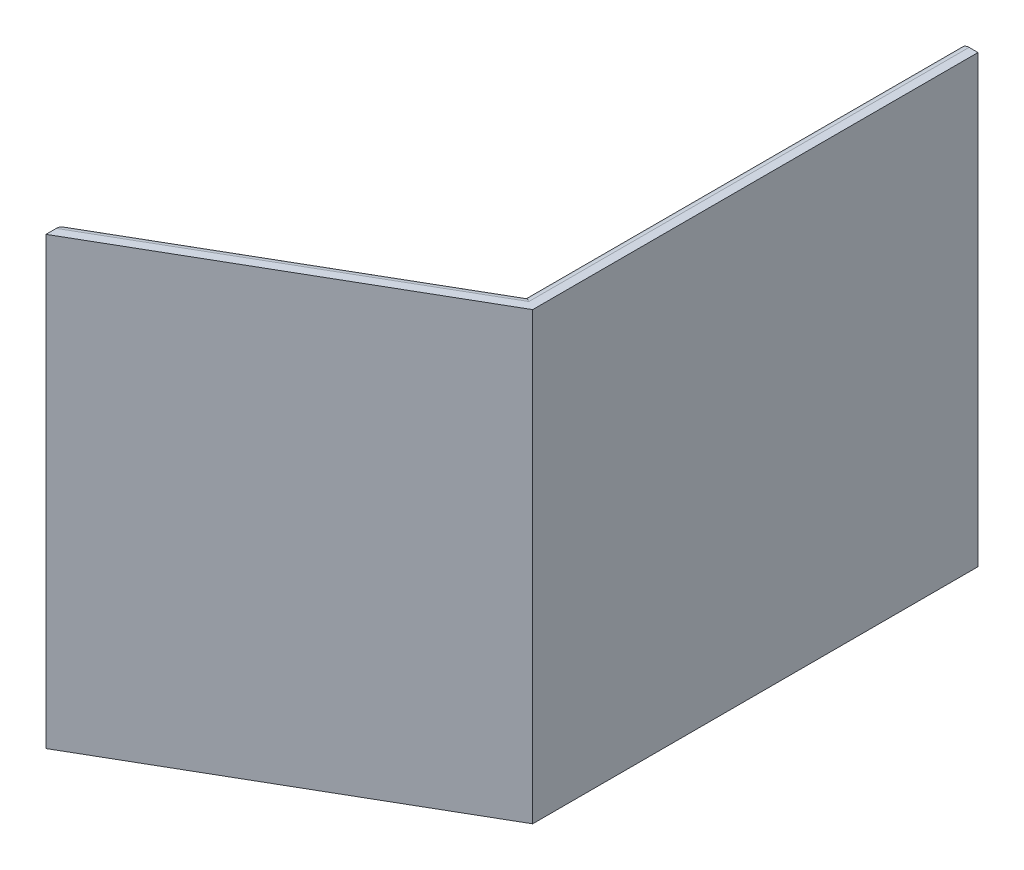
ISO-10303-21;
HEADER;
FILE_DESCRIPTION(('STEP AP214'),'2;1');
FILE_NAME('part.step','',(''),(''),'','','');
FILE_SCHEMA(('AUTOMOTIVE_DESIGN { 1 0 10303 214 1 1 1 1 }'));
ENDSEC;
DATA;
#1=APPLICATION_CONTEXT('core data for automotive mechanical design processes');
#2=APPLICATION_PROTOCOL_DEFINITION('international standard','automotive_design',2000,#1);
#3=PRODUCT_CONTEXT('',#1,'mechanical');
#4=PRODUCT('Part','Part','',(#3));
#5=PRODUCT_RELATED_PRODUCT_CATEGORY('part','',(#4));
#6=PRODUCT_DEFINITION_FORMATION('','',#4);
#7=PRODUCT_DEFINITION_CONTEXT('part definition',#1,'design');
#8=PRODUCT_DEFINITION('design','',#6,#7);
#9=PRODUCT_DEFINITION_SHAPE('','',#8);
#10=(LENGTH_UNIT() NAMED_UNIT(*) SI_UNIT(.MILLI.,.METRE.));
#11=(NAMED_UNIT(*) PLANE_ANGLE_UNIT() SI_UNIT($,.RADIAN.));
#12=(NAMED_UNIT(*) SI_UNIT($,.STERADIAN.) SOLID_ANGLE_UNIT());
#13=UNCERTAINTY_MEASURE_WITH_UNIT(LENGTH_MEASURE(1.E-05),#10,'distance_accuracy_value','');
#14=(GEOMETRIC_REPRESENTATION_CONTEXT(3) GLOBAL_UNCERTAINTY_ASSIGNED_CONTEXT((#13)) GLOBAL_UNIT_ASSIGNED_CONTEXT((#10,
#11,#12)) REPRESENTATION_CONTEXT('',''));
#15=CARTESIAN_POINT('',(0.,0.,0.));
#16=DIRECTION('',(0.,0.,1.));
#17=DIRECTION('',(1.,0.,0.));
#18=AXIS2_PLACEMENT_3D('',#15,#16,#17);
#19=CARTESIAN_POINT('',(1026.36124877676,50.,-43.687256240298));
#20=DIRECTION('',(1.,0.,0.));
#21=DIRECTION('',(0.,0.,-1.));
#22=AXIS2_PLACEMENT_3D('',#19,#20,#21);
#23=PLANE('',#22);
#24=DIRECTION('',(0.,1.,0.));
#25=VECTOR('',#24,1.);
#26=CARTESIAN_POINT('',(1026.36124877676,2.,-32.1402508565054));
#27=LINE('',#26,#25);
#28=CARTESIAN_POINT('',(1026.36124877676,4.,-32.1402508565054));
#29=VERTEX_POINT('',#28);
#30=CARTESIAN_POINT('',(1026.36124877676,49.,-32.1402508565054));
#31=VERTEX_POINT('',#30);
#32=EDGE_CURVE('E192',#29,#31,#27,.T.);
#33=ORIENTED_EDGE('',*,*,#32,.F.);
#34=CARTESIAN_POINT('',(1026.36124877676,4.,-34.4496519332638));
#35=DIRECTION('',(1.,0.,0.));
#36=DIRECTION('',(0.,0.,1.));
#37=AXIS2_PLACEMENT_3D('',#34,#35,#36);
#38=ELLIPSE('',#37,2.3094010767585,2.);
#39=CARTESIAN_POINT('',(1026.36124877676,2.,-34.4496519332638));
#40=VERTEX_POINT('',#39);
#41=EDGE_CURVE('E42',#29,#40,#38,.T.);
#42=ORIENTED_EDGE('',*,*,#41,.T.);
#43=DIRECTION('',(0.,0.,-1.));
#44=VECTOR('',#43,1.);
#45=CARTESIAN_POINT('',(1026.36124877676,2.,-43.687256240298));
#46=LINE('',#45,#44);
#47=CARTESIAN_POINT('',(1026.36124877676,2.,-42.5325557019189));
#48=VERTEX_POINT('',#47);
#49=EDGE_CURVE('E205',#40,#48,#46,.T.);
#50=ORIENTED_EDGE('',*,*,#49,.T.);
#51=CARTESIAN_POINT('',(1026.36124877676,1.,-42.5325557019188));
#52=DIRECTION('',(1.,0.,0.));
#53=DIRECTION('',(0.,0.,-1.));
#54=AXIS2_PLACEMENT_3D('',#51,#52,#53);
#55=ELLIPSE('',#54,1.15470053837925,1.);
#56=CARTESIAN_POINT('',(1026.36124877676,1.,-43.687256240298));
#57=VERTEX_POINT('',#56);
#58=EDGE_CURVE('E177',#48,#57,#55,.F.);
#59=ORIENTED_EDGE('',*,*,#58,.T.);
#60=DIRECTION('',(0.,-1.,0.));
#61=VECTOR('',#60,1.);
#62=CARTESIAN_POINT('',(1026.36124877676,50.,-43.687256240298));
#63=LINE('',#62,#61);
#64=CARTESIAN_POINT('',(1026.36124877676,0.,-43.687256240298));
#65=VERTEX_POINT('',#64);
#66=EDGE_CURVE('E235',#57,#65,#63,.T.);
#67=ORIENTED_EDGE('',*,*,#66,.T.);
#68=DIRECTION('',(0.,0.,1.));
#69=VECTOR('',#68,1.);
#70=CARTESIAN_POINT('',(1026.36124877676,0.,-43.687256240298));
#71=LINE('',#70,#69);
#72=CARTESIAN_POINT('',(1026.36124877676,0.,-29.8308497797469));
#73=VERTEX_POINT('',#72);
#74=EDGE_CURVE('E155',#65,#73,#71,.T.);
#75=ORIENTED_EDGE('',*,*,#74,.T.);
#76=DIRECTION('',(0.,-1.,0.));
#77=VECTOR('',#76,1.);
#78=CARTESIAN_POINT('',(1026.36124877676,50.,-29.8308497797469));
#79=LINE('',#78,#77);
#80=CARTESIAN_POINT('',(1026.36124877676,50.,-29.8308497797469));
#81=VERTEX_POINT('',#80);
#82=EDGE_CURVE('E146',#81,#73,#79,.T.);
#83=ORIENTED_EDGE('',*,*,#82,.F.);
#84=DIRECTION('',(0.,0.,1.));
#85=VECTOR('',#84,1.);
#86=CARTESIAN_POINT('',(1026.36124877676,50.,-43.687256240298));
#87=LINE('',#86,#85);
#88=CARTESIAN_POINT('',(1026.36124877676,50.,-30.9855503181262));
#89=VERTEX_POINT('',#88);
#90=EDGE_CURVE('E130',#89,#81,#87,.T.);
#91=ORIENTED_EDGE('',*,*,#90,.F.);
#92=CARTESIAN_POINT('',(1026.36124877676,49.,-30.9855503181262));
#93=DIRECTION('',(1.,0.,0.));
#94=DIRECTION('',(0.,0.,-1.));
#95=AXIS2_PLACEMENT_3D('',#92,#93,#94);
#96=ELLIPSE('',#95,1.15470053837925,1.);
#97=EDGE_CURVE('E175',#89,#31,#96,.F.);
#98=ORIENTED_EDGE('',*,*,#97,.T.);
#99=EDGE_LOOP('',(#33,#42,#50,#59,#67,#75,#83,#91,#98));
#100=FACE_BOUND('',#99,.T.);
#101=ADVANCED_FACE('F33',(#100),#23,.F.);
#102=CARTESIAN_POINT('',(1026.36124877676,50.,-29.8308497797469));
#103=DIRECTION('',(-0.500000000000005,0.,-0.866025403784436));
#104=DIRECTION('',(-0.866025403784436,0.,0.500000000000005));
#105=AXIS2_PLACEMENT_3D('',#102,#103,#104);
#106=PLANE('',#105);
#107=DIRECTION('',(0.866025403784436,0.,-0.500000000000005));
#108=VECTOR('',#107,1.);
#109=CARTESIAN_POINT('',(1026.36124877676,0.,-29.8308497797469));
#110=LINE('',#109,#108);
#111=CARTESIAN_POINT('',(1061.00226492813,0.,-49.8308497797472));
#112=VERTEX_POINT('',#111);
#113=EDGE_CURVE('E237',#73,#112,#110,.T.);
#114=ORIENTED_EDGE('',*,*,#113,.T.);
#115=DIRECTION('',(0.,-1.,0.));
#116=VECTOR('',#115,1.);
#117=CARTESIAN_POINT('',(1061.00226492813,50.,-49.8308497797472));
#118=LINE('',#117,#116);
#119=CARTESIAN_POINT('',(1061.00226492813,50.,-49.8308497797472));
#120=VERTEX_POINT('',#119);
#121=EDGE_CURVE('E149',#120,#112,#118,.T.);
#122=ORIENTED_EDGE('',*,*,#121,.F.);
#123=DIRECTION('',(0.866025403784436,0.,-0.500000000000005));
#124=VECTOR('',#123,1.);
#125=CARTESIAN_POINT('',(1026.36124877676,50.,-29.8308497797469));
#126=LINE('',#125,#124);
#127=EDGE_CURVE('E133',#81,#120,#126,.T.);
#128=ORIENTED_EDGE('',*,*,#127,.F.);
#129=ORIENTED_EDGE('',*,*,#82,.T.);
#130=EDGE_LOOP('',(#114,#122,#128,#129));
#131=FACE_BOUND('',#130,.T.);
#132=ADVANCED_FACE('F145',(#131),#106,.F.);
#133=CARTESIAN_POINT('',(1061.00226492813,50.,-49.8308497797472));
#134=DIRECTION('',(-1.,0.,0.));
#135=DIRECTION('',(0.,0.,1.));
#136=AXIS2_PLACEMENT_3D('',#133,#134,#135);
#137=PLANE('',#136);
#138=DIRECTION('',(0.,0.,-1.));
#139=VECTOR('',#138,1.);
#140=CARTESIAN_POINT('',(1061.00226492813,0.,-49.8308497797472));
#141=LINE('',#140,#139);
#142=CARTESIAN_POINT('',(1061.00226492813,0.,-99.8308497797472));
#143=VERTEX_POINT('',#142);
#144=EDGE_CURVE('E239',#112,#143,#141,.T.);
#145=ORIENTED_EDGE('',*,*,#144,.T.);
#146=DIRECTION('',(0.,-1.,0.));
#147=VECTOR('',#146,1.);
#148=CARTESIAN_POINT('',(1061.00226492813,50.,-99.8308497797472));
#149=LINE('',#148,#147);
#150=CARTESIAN_POINT('',(1061.00226492813,50.,-99.8308497797472));
#151=VERTEX_POINT('',#150);
#152=EDGE_CURVE('E161',#151,#143,#149,.T.);
#153=ORIENTED_EDGE('',*,*,#152,.F.);
#154=DIRECTION('',(0.,0.,-1.));
#155=VECTOR('',#154,1.);
#156=CARTESIAN_POINT('',(1061.00226492813,50.,-49.8308497797472));
#157=LINE('',#156,#155);
#158=EDGE_CURVE('E151',#120,#151,#157,.T.);
#159=ORIENTED_EDGE('',*,*,#158,.F.);
#160=ORIENTED_EDGE('',*,*,#121,.T.);
#161=EDGE_LOOP('',(#145,#153,#159,#160));
#162=FACE_BOUND('',#161,.T.);
#163=ADVANCED_FACE('F276',(#162),#137,.F.);
#164=CARTESIAN_POINT('',(1061.00226492813,50.,-99.8308497797472));
#165=DIRECTION('',(0.,0.,1.));
#166=DIRECTION('',(1.,0.,0.));
#167=AXIS2_PLACEMENT_3D('',#164,#165,#166);
#168=PLANE('',#167);
#169=DIRECTION('',(0.,-1.,0.));
#170=VECTOR('',#169,1.);
#171=CARTESIAN_POINT('',(1049.00226492813,50.,-99.8308497797472));
#172=LINE('',#171,#170);
#173=CARTESIAN_POINT('',(1049.00226492813,1.,-99.8308497797472));
#174=VERTEX_POINT('',#173);
#175=CARTESIAN_POINT('',(1049.00226492813,0.,-99.8308497797472));
#176=VERTEX_POINT('',#175);
#177=EDGE_CURVE('E252',#174,#176,#172,.T.);
#178=ORIENTED_EDGE('',*,*,#177,.F.);
#179=CARTESIAN_POINT('',(1050.00226492813,1.,-99.8308497797472));
#180=DIRECTION('',(0.,0.,1.));
#181=DIRECTION('',(1.,0.,0.));
#182=AXIS2_PLACEMENT_3D('',#179,#180,#181);
#183=CIRCLE('',#182,1.);
#184=CARTESIAN_POINT('',(1050.00226492813,2.,-99.8308497797472));
#185=VERTEX_POINT('',#184);
#186=EDGE_CURVE('E166',#174,#185,#183,.F.);
#187=ORIENTED_EDGE('',*,*,#186,.T.);
#188=DIRECTION('',(1.,0.,0.));
#189=VECTOR('',#188,1.);
#190=CARTESIAN_POINT('',(1061.00226492813,2.,-99.8308497797472));
#191=LINE('',#190,#189);
#192=CARTESIAN_POINT('',(1057.00226492813,2.,-99.8308497797472));
#193=VERTEX_POINT('',#192);
#194=EDGE_CURVE('E213',#185,#193,#191,.T.);
#195=ORIENTED_EDGE('',*,*,#194,.T.);
#196=CARTESIAN_POINT('',(1057.00226492813,4.,-99.8308497797472));
#197=DIRECTION('',(0.,0.,1.));
#198=DIRECTION('',(1.,0.,0.));
#199=AXIS2_PLACEMENT_3D('',#196,#197,#198);
#200=CIRCLE('',#199,2.);
#201=CARTESIAN_POINT('',(1059.00226492813,4.,-99.8308497797472));
#202=VERTEX_POINT('',#201);
#203=EDGE_CURVE('E11',#193,#202,#200,.T.);
#204=ORIENTED_EDGE('',*,*,#203,.T.);
#205=DIRECTION('',(0.,1.,0.));
#206=VECTOR('',#205,1.);
#207=CARTESIAN_POINT('',(1059.00226492813,2.,-99.8308497797472));
#208=LINE('',#207,#206);
#209=CARTESIAN_POINT('',(1059.00226492813,49.,-99.8308497797472));
#210=VERTEX_POINT('',#209);
#211=EDGE_CURVE('E224',#202,#210,#208,.T.);
#212=ORIENTED_EDGE('',*,*,#211,.T.);
#213=CARTESIAN_POINT('',(1060.00226492813,49.,-99.8308497797472));
#214=DIRECTION('',(0.,0.,1.));
#215=DIRECTION('',(1.,0.,0.));
#216=AXIS2_PLACEMENT_3D('',#213,#214,#215);
#217=CIRCLE('',#216,1.);
#218=CARTESIAN_POINT('',(1060.00226492813,50.,-99.8308497797472));
#219=VERTEX_POINT('',#218);
#220=EDGE_CURVE('E159',#210,#219,#217,.F.);
#221=ORIENTED_EDGE('',*,*,#220,.T.);
#222=DIRECTION('',(-1.,0.,0.));
#223=VECTOR('',#222,1.);
#224=CARTESIAN_POINT('',(1061.00226492813,50.,-99.8308497797472));
#225=LINE('',#224,#223);
#226=EDGE_CURVE('E232',#151,#219,#225,.T.);
#227=ORIENTED_EDGE('',*,*,#226,.F.);
#228=ORIENTED_EDGE('',*,*,#152,.T.);
#229=DIRECTION('',(-1.,0.,0.));
#230=VECTOR('',#229,1.);
#231=CARTESIAN_POINT('',(1061.00226492813,0.,-99.8308497797472));
#232=LINE('',#231,#230);
#233=EDGE_CURVE('E241',#143,#176,#232,.T.);
#234=ORIENTED_EDGE('',*,*,#233,.T.);
#235=EDGE_LOOP('',(#178,#187,#195,#204,#212,#221,#227,#228,#234));
#236=FACE_BOUND('',#235,.T.);
#237=ADVANCED_FACE('F223',(#236),#168,.F.);
#238=CARTESIAN_POINT('',(1049.00226492813,50.,-99.8308497797472));
#239=DIRECTION('',(1.,0.,0.));
#240=DIRECTION('',(0.,0.,-1.));
#241=AXIS2_PLACEMENT_3D('',#238,#239,#240);
#242=PLANE('',#241);
#243=DIRECTION('',(0.,-1.,0.));
#244=VECTOR('',#243,1.);
#245=CARTESIAN_POINT('',(1049.00226492813,50.,-56.7590530100226));
#246=LINE('',#245,#244);
#247=CARTESIAN_POINT('',(1049.00226492813,1.,-56.7590530100226));
#248=VERTEX_POINT('',#247);
#249=CARTESIAN_POINT('',(1049.00226492813,0.,-56.7590530100226));
#250=VERTEX_POINT('',#249);
#251=EDGE_CURVE('E250',#248,#250,#246,.T.);
#252=ORIENTED_EDGE('',*,*,#251,.F.);
#253=DIRECTION('',(0.,0.,-1.));
#254=VECTOR('',#253,1.);
#255=CARTESIAN_POINT('',(1049.00226492813,1.,-99.8308497797472));
#256=LINE('',#255,#254);
#257=EDGE_CURVE('E156',#248,#174,#256,.T.);
#258=ORIENTED_EDGE('',*,*,#257,.T.);
#259=ORIENTED_EDGE('',*,*,#177,.T.);
#260=DIRECTION('',(0.,0.,1.));
#261=VECTOR('',#260,1.);
#262=CARTESIAN_POINT('',(1049.00226492813,0.,-99.8308497797472));
#263=LINE('',#262,#261);
#264=EDGE_CURVE('E244',#176,#250,#263,.T.);
#265=ORIENTED_EDGE('',*,*,#264,.T.);
#266=EDGE_LOOP('',(#252,#258,#259,#265));
#267=FACE_BOUND('',#266,.T.);
#268=ADVANCED_FACE('F265',(#267),#242,.F.);
#269=CARTESIAN_POINT('',(1049.00226492813,50.,-56.7590530100226));
#270=DIRECTION('',(0.500000000000004,0.,0.866025403784437));
#271=DIRECTION('',(0.866025403784437,0.,-0.500000000000004));
#272=AXIS2_PLACEMENT_3D('',#269,#270,#271);
#273=PLANE('',#272);
#274=ORIENTED_EDGE('',*,*,#66,.F.);
#275=DIRECTION('',(0.866025403784437,0.,-0.500000000000004));
#276=VECTOR('',#275,1.);
#277=CARTESIAN_POINT('',(1049.00226492813,1.,-56.7590530100226));
#278=LINE('',#277,#276);
#279=EDGE_CURVE('E173',#57,#248,#278,.T.);
#280=ORIENTED_EDGE('',*,*,#279,.T.);
#281=ORIENTED_EDGE('',*,*,#251,.T.);
#282=DIRECTION('',(-0.866025403784437,0.,0.500000000000004));
#283=VECTOR('',#282,1.);
#284=CARTESIAN_POINT('',(1049.00226492813,0.,-56.7590530100226));
#285=LINE('',#284,#283);
#286=EDGE_CURVE('E141',#250,#65,#285,.T.);
#287=ORIENTED_EDGE('',*,*,#286,.T.);
#288=EDGE_LOOP('',(#274,#280,#281,#287));
#289=FACE_BOUND('',#288,.T.);
#290=ADVANCED_FACE('F275',(#289),#273,.F.);
#291=CARTESIAN_POINT('',(0.,50.,0.));
#292=DIRECTION('',(0.,-1.,0.));
#293=DIRECTION('',(0.,0.,-1.));
#294=AXIS2_PLACEMENT_3D('',#291,#292,#293);
#295=PLANE('',#294);
#296=DIRECTION('',(0.,0.,-1.));
#297=VECTOR('',#296,1.);
#298=CARTESIAN_POINT('',(1060.00226492813,50.,0.));
#299=LINE('',#298,#297);
#300=CARTESIAN_POINT('',(1060.00226492813,50.,-50.4082000489365));
#301=VERTEX_POINT('',#300);
#302=EDGE_CURVE('E182',#219,#301,#299,.F.);
#303=ORIENTED_EDGE('',*,*,#302,.T.);
#304=DIRECTION('',(0.866025403784438,0.,-0.5));
#305=VECTOR('',#304,1.);
#306=CARTESIAN_POINT('',(243.17317533132,50.,421.188294711701));
#307=LINE('',#306,#305);
#308=EDGE_CURVE('E136',#301,#89,#307,.F.);
#309=ORIENTED_EDGE('',*,*,#308,.T.);
#310=ORIENTED_EDGE('',*,*,#90,.T.);
#311=ORIENTED_EDGE('',*,*,#127,.T.);
#312=ORIENTED_EDGE('',*,*,#158,.T.);
#313=ORIENTED_EDGE('',*,*,#226,.T.);
#314=EDGE_LOOP('',(#303,#309,#310,#311,#312,#313));
#315=FACE_BOUND('',#314,.T.);
#316=ADVANCED_FACE('F132',(#315),#295,.F.);
#317=CARTESIAN_POINT('',(0.,0.,0.));
#318=DIRECTION('',(0.,-1.,0.));
#319=DIRECTION('',(0.,0.,-1.));
#320=AXIS2_PLACEMENT_3D('',#317,#318,#319);
#321=PLANE('',#320);
#322=CARTESIAN_POINT('',(1039.94226492813,0.,-46.3321071484577));
#323=DIRECTION('',(0.,1.,0.));
#324=DIRECTION('',(0.,0.,1.));
#325=AXIS2_PLACEMENT_3D('',#322,#323,#324);
#326=CIRCLE('',#325,1.60000000000013);
#327=CARTESIAN_POINT('',(1039.94226492813,0.,-44.7321071484576));
#328=VERTEX_POINT('',#327);
#329=EDGE_CURVE('E219',#328,#328,#326,.T.);
#330=ORIENTED_EDGE('',*,*,#329,.T.);
#331=EDGE_LOOP('',(#330));
#332=FACE_BOUND('',#331,.T.);
#333=CARTESIAN_POINT('',(1053.50226492813,0.,-59.8308497797472));
#334=DIRECTION('',(0.,1.,0.));
#335=DIRECTION('',(0.,0.,1.));
#336=AXIS2_PLACEMENT_3D('',#333,#334,#335);
#337=CIRCLE('',#336,1.60000000000013);
#338=CARTESIAN_POINT('',(1053.50226492813,0.,-58.230849779747));
#339=VERTEX_POINT('',#338);
#340=EDGE_CURVE('E298',#339,#339,#337,.T.);
#341=ORIENTED_EDGE('',*,*,#340,.T.);
#342=EDGE_LOOP('',(#341));
#343=FACE_BOUND('',#342,.T.);
#344=CARTESIAN_POINT('',(1053.50226492813,0.,-89.8308497797472));
#345=DIRECTION('',(0.,1.,0.));
#346=DIRECTION('',(0.,0.,1.));
#347=AXIS2_PLACEMENT_3D('',#344,#345,#346);
#348=CIRCLE('',#347,1.60000000000013);
#349=CARTESIAN_POINT('',(1053.50226492813,0.,-88.2308497797471));
#350=VERTEX_POINT('',#349);
#351=EDGE_CURVE('E292',#350,#350,#348,.T.);
#352=ORIENTED_EDGE('',*,*,#351,.T.);
#353=EDGE_LOOP('',(#352));
#354=FACE_BOUND('',#353,.T.);
#355=ORIENTED_EDGE('',*,*,#74,.F.);
#356=ORIENTED_EDGE('',*,*,#286,.F.);
#357=ORIENTED_EDGE('',*,*,#264,.F.);
#358=ORIENTED_EDGE('',*,*,#233,.F.);
#359=ORIENTED_EDGE('',*,*,#144,.F.);
#360=ORIENTED_EDGE('',*,*,#113,.F.);
#361=EDGE_LOOP('',(#355,#356,#357,#358,#359,#360));
#362=FACE_BOUND('',#361,.T.);
#363=ADVANCED_FACE('F261',(#332,#343,#354,#362),#321,.T.);
#364=CARTESIAN_POINT('',(0.,2.,0.));
#365=DIRECTION('',(0.,-1.,0.));
#366=DIRECTION('',(0.,0.,-1.));
#367=AXIS2_PLACEMENT_3D('',#364,#365,#366);
#368=PLANE('',#367);
#369=CARTESIAN_POINT('',(1039.94226492813,2.,-46.3321071484577));
#370=DIRECTION('',(0.,1.,0.));
#371=DIRECTION('',(0.,0.,1.));
#372=AXIS2_PLACEMENT_3D('',#369,#370,#371);
#373=CIRCLE('',#372,1.60000000000013);
#374=CARTESIAN_POINT('',(1039.94226492813,2.,-44.7321071484576));
#375=VERTEX_POINT('',#374);
#376=EDGE_CURVE('E301',#375,#375,#373,.T.);
#377=ORIENTED_EDGE('',*,*,#376,.F.);
#378=EDGE_LOOP('',(#377));
#379=FACE_BOUND('',#378,.T.);
#380=CARTESIAN_POINT('',(1053.50226492813,2.,-59.8308497797472));
#381=DIRECTION('',(0.,1.,0.));
#382=DIRECTION('',(0.,0.,1.));
#383=AXIS2_PLACEMENT_3D('',#380,#381,#382);
#384=CIRCLE('',#383,1.60000000000013);
#385=CARTESIAN_POINT('',(1053.50226492813,2.,-58.230849779747));
#386=VERTEX_POINT('',#385);
#387=EDGE_CURVE('E295',#386,#386,#384,.T.);
#388=ORIENTED_EDGE('',*,*,#387,.F.);
#389=EDGE_LOOP('',(#388));
#390=FACE_BOUND('',#389,.T.);
#391=CARTESIAN_POINT('',(1053.50226492813,2.,-89.8308497797472));
#392=DIRECTION('',(0.,1.,0.));
#393=DIRECTION('',(0.,0.,1.));
#394=AXIS2_PLACEMENT_3D('',#391,#392,#393);
#395=CIRCLE('',#394,1.60000000000013);
#396=CARTESIAN_POINT('',(1053.50226492813,2.,-88.2308497797471));
#397=VERTEX_POINT('',#396);
#398=EDGE_CURVE('E289',#397,#397,#395,.T.);
#399=ORIENTED_EDGE('',*,*,#398,.F.);
#400=EDGE_LOOP('',(#399));
#401=FACE_BOUND('',#400,.T.);
#402=ORIENTED_EDGE('',*,*,#49,.F.);
#403=DIRECTION('',(0.866025403784438,0.,-0.5));
#404=VECTOR('',#403,1.);
#405=CARTESIAN_POINT('',(1058.00226492813,2.,-52.717601125695));
#406=LINE('',#405,#404);
#407=CARTESIAN_POINT('',(1057.00226492813,2.,-52.1402508565053));
#408=VERTEX_POINT('',#407);
#409=EDGE_CURVE('E197',#40,#408,#406,.T.);
#410=ORIENTED_EDGE('',*,*,#409,.T.);
#411=DIRECTION('',(0.,0.,-1.));
#412=VECTOR('',#411,1.);
#413=CARTESIAN_POINT('',(1057.00226492813,2.,-99.8308497797472));
#414=LINE('',#413,#412);
#415=EDGE_CURVE('E188',#408,#193,#414,.T.);
#416=ORIENTED_EDGE('',*,*,#415,.T.);
#417=ORIENTED_EDGE('',*,*,#194,.F.);
#418=DIRECTION('',(0.,0.,-1.));
#419=VECTOR('',#418,1.);
#420=CARTESIAN_POINT('',(1050.00226492813,2.,0.));
#421=LINE('',#420,#419);
#422=CARTESIAN_POINT('',(1050.00226492813,2.,-56.181702740833));
#423=VERTEX_POINT('',#422);
#424=EDGE_CURVE('E171',#185,#423,#421,.F.);
#425=ORIENTED_EDGE('',*,*,#424,.T.);
#426=DIRECTION('',(0.866025403784437,0.,-0.500000000000004));
#427=VECTOR('',#426,1.);
#428=CARTESIAN_POINT('',(238.173175331324,2.,412.528040673859));
#429=LINE('',#428,#427);
#430=EDGE_CURVE('E168',#423,#48,#429,.F.);
#431=ORIENTED_EDGE('',*,*,#430,.T.);
#432=EDGE_LOOP('',(#402,#410,#416,#417,#425,#431));
#433=FACE_BOUND('',#432,.T.);
#434=ADVANCED_FACE('F210',(#379,#390,#401,#433),#368,.F.);
#435=CARTESIAN_POINT('',(1059.00226492813,2.,-99.8308497797472));
#436=DIRECTION('',(1.,0.,0.));
#437=DIRECTION('',(0.,0.,-1.));
#438=AXIS2_PLACEMENT_3D('',#435,#436,#437);
#439=PLANE('',#438);
#440=ORIENTED_EDGE('',*,*,#211,.F.);
#441=DIRECTION('',(0.,0.,-1.));
#442=VECTOR('',#441,1.);
#443=CARTESIAN_POINT('',(1059.00226492813,4.,-50.9855503181261));
#444=LINE('',#443,#442);
#445=CARTESIAN_POINT('',(1059.00226492813,4.,-50.9855503181261));
#446=VERTEX_POINT('',#445);
#447=EDGE_CURVE('E54',#202,#446,#444,.F.);
#448=ORIENTED_EDGE('',*,*,#447,.T.);
#449=DIRECTION('',(0.,1.,0.));
#450=VECTOR('',#449,1.);
#451=CARTESIAN_POINT('',(1059.00226492813,2.,-50.9855503181261));
#452=LINE('',#451,#450);
#453=CARTESIAN_POINT('',(1059.00226492813,49.,-50.9855503181261));
#454=VERTEX_POINT('',#453);
#455=EDGE_CURVE('E226',#446,#454,#452,.T.);
#456=ORIENTED_EDGE('',*,*,#455,.T.);
#457=DIRECTION('',(0.,0.,-1.));
#458=VECTOR('',#457,1.);
#459=CARTESIAN_POINT('',(1059.00226492813,49.,-99.8308497797472));
#460=LINE('',#459,#458);
#461=EDGE_CURVE('E185',#454,#210,#460,.T.);
#462=ORIENTED_EDGE('',*,*,#461,.T.);
#463=EDGE_LOOP('',(#440,#448,#456,#462));
#464=FACE_BOUND('',#463,.T.);
#465=ADVANCED_FACE('F318',(#464),#439,.F.);
#466=CARTESIAN_POINT('',(1059.00226492813,2.,-50.9855503181261));
#467=DIRECTION('',(0.5,0.,0.866025403784438));
#468=DIRECTION('',(0.866025403784438,0.,-0.5));
#469=AXIS2_PLACEMENT_3D('',#466,#467,#468);
#470=PLANE('',#469);
#471=ORIENTED_EDGE('',*,*,#455,.F.);
#472=DIRECTION('',(0.866025403784438,0.,-0.5));
#473=VECTOR('',#472,1.);
#474=CARTESIAN_POINT('',(1026.36124877676,4.,-32.1402508565054));
#475=LINE('',#474,#473);
#476=EDGE_CURVE('E200',#446,#29,#475,.F.);
#477=ORIENTED_EDGE('',*,*,#476,.T.);
#478=ORIENTED_EDGE('',*,*,#32,.T.);
#479=DIRECTION('',(0.866025403784438,0.,-0.5));
#480=VECTOR('',#479,1.);
#481=CARTESIAN_POINT('',(1059.00226492813,49.,-50.9855503181261));
#482=LINE('',#481,#480);
#483=EDGE_CURVE('E179',#31,#454,#482,.T.);
#484=ORIENTED_EDGE('',*,*,#483,.T.);
#485=EDGE_LOOP('',(#471,#477,#478,#484));
#486=FACE_BOUND('',#485,.T.);
#487=ADVANCED_FACE('F287',(#486),#470,.F.);
#488=CARTESIAN_POINT('',(1049.50226492813,1.,-55.8930276062382));
#489=DIRECTION('',(0.866025403784437,0.,-0.500000000000004));
#490=DIRECTION('',(-0.500000000000004,0.,-0.866025403784437));
#491=AXIS2_PLACEMENT_3D('',#488,#489,#490);
#492=CYLINDRICAL_SURFACE('',#491,1.);
#493=ORIENTED_EDGE('',*,*,#58,.F.);
#494=ORIENTED_EDGE('',*,*,#430,.F.);
#495=CARTESIAN_POINT('',(1050.00226492813,1.,-56.181702740833));
#496=DIRECTION('',(0.499999999999998,0.,-0.86602540378444));
#497=DIRECTION('',(-0.86602540378444,0.,-0.499999999999998));
#498=AXIS2_PLACEMENT_3D('',#495,#496,#497);
#499=ELLIPSE('',#498,1.15470053837925,1.);
#500=EDGE_CURVE('E189',#248,#423,#499,.T.);
#501=ORIENTED_EDGE('',*,*,#500,.F.);
#502=ORIENTED_EDGE('',*,*,#279,.F.);
#503=EDGE_LOOP('',(#493,#494,#501,#502));
#504=FACE_BOUND('',#503,.T.);
#505=ADVANCED_FACE('F271',(#504),#492,.T.);
#506=CARTESIAN_POINT('',(1050.00226492813,1.,-99.8308497797472));
#507=DIRECTION('',(0.,0.,-1.));
#508=DIRECTION('',(-1.,0.,0.));
#509=AXIS2_PLACEMENT_3D('',#506,#507,#508);
#510=CYLINDRICAL_SURFACE('',#509,1.);
#511=ORIENTED_EDGE('',*,*,#500,.T.);
#512=ORIENTED_EDGE('',*,*,#424,.F.);
#513=ORIENTED_EDGE('',*,*,#186,.F.);
#514=ORIENTED_EDGE('',*,*,#257,.F.);
#515=EDGE_LOOP('',(#511,#512,#513,#514));
#516=FACE_BOUND('',#515,.T.);
#517=ADVANCED_FACE('F269',(#516),#510,.T.);
#518=CARTESIAN_POINT('',(1060.00226492813,49.,-99.8308497797472));
#519=DIRECTION('',(0.,0.,-1.));
#520=DIRECTION('',(-1.,0.,0.));
#521=AXIS2_PLACEMENT_3D('',#518,#519,#520);
#522=CYLINDRICAL_SURFACE('',#521,1.);
#523=ORIENTED_EDGE('',*,*,#220,.F.);
#524=ORIENTED_EDGE('',*,*,#461,.F.);
#525=CARTESIAN_POINT('',(1060.00226492813,49.,-50.4082000489365));
#526=DIRECTION('',(0.5,0.,-0.866025403784439));
#527=DIRECTION('',(0.866025403784439,0.,0.5));
#528=AXIS2_PLACEMENT_3D('',#525,#526,#527);
#529=ELLIPSE('',#528,1.15470053837925,1.);
#530=EDGE_CURVE('E193',#301,#454,#529,.F.);
#531=ORIENTED_EDGE('',*,*,#530,.F.);
#532=ORIENTED_EDGE('',*,*,#302,.F.);
#533=EDGE_LOOP('',(#523,#524,#531,#532));
#534=FACE_BOUND('',#533,.T.);
#535=ADVANCED_FACE('F281',(#534),#522,.T.);
#536=CARTESIAN_POINT('',(1059.50226492813,49.,-50.1195249143417));
#537=DIRECTION('',(0.866025403784438,0.,-0.5));
#538=DIRECTION('',(-0.5,0.,-0.866025403784438));
#539=AXIS2_PLACEMENT_3D('',#536,#537,#538);
#540=CYLINDRICAL_SURFACE('',#539,1.);
#541=ORIENTED_EDGE('',*,*,#97,.F.);
#542=ORIENTED_EDGE('',*,*,#308,.F.);
#543=ORIENTED_EDGE('',*,*,#530,.T.);
#544=ORIENTED_EDGE('',*,*,#483,.F.);
#545=EDGE_LOOP('',(#541,#542,#543,#544));
#546=FACE_BOUND('',#545,.T.);
#547=ADVANCED_FACE('F285',(#546),#540,.T.);
#548=CARTESIAN_POINT('',(1057.00226492813,4.,0.));
#549=DIRECTION('',(0.,0.,1.));
#550=DIRECTION('',(1.,0.,0.));
#551=AXIS2_PLACEMENT_3D('',#548,#549,#550);
#552=CYLINDRICAL_SURFACE('',#551,2.);
#553=ORIENTED_EDGE('',*,*,#203,.F.);
#554=ORIENTED_EDGE('',*,*,#415,.F.);
#555=CARTESIAN_POINT('',(1057.00226492813,4.,-52.1402508565053));
#556=DIRECTION('',(-0.5,0.,0.866025403784439));
#557=DIRECTION('',(-0.866025403784439,0.,-0.5));
#558=AXIS2_PLACEMENT_3D('',#555,#556,#557);
#559=ELLIPSE('',#558,2.3094010767585,2.);
#560=EDGE_CURVE('E37',#446,#408,#559,.F.);
#561=ORIENTED_EDGE('',*,*,#560,.F.);
#562=ORIENTED_EDGE('',*,*,#447,.F.);
#563=EDGE_LOOP('',(#553,#554,#561,#562));
#564=FACE_BOUND('',#563,.T.);
#565=ADVANCED_FACE('F35',(#564),#552,.F.);
#566=CARTESIAN_POINT('',(241.67317533132,4.,418.590218500348));
#567=DIRECTION('',(-0.866025403784438,0.,0.5));
#568=DIRECTION('',(0.5,0.,0.866025403784438));
#569=AXIS2_PLACEMENT_3D('',#566,#567,#568);
#570=CYLINDRICAL_SURFACE('',#569,2.);
#571=ORIENTED_EDGE('',*,*,#41,.F.);
#572=ORIENTED_EDGE('',*,*,#476,.F.);
#573=ORIENTED_EDGE('',*,*,#560,.T.);
#574=ORIENTED_EDGE('',*,*,#409,.F.);
#575=EDGE_LOOP('',(#571,#572,#573,#574));
#576=FACE_BOUND('',#575,.T.);
#577=ADVANCED_FACE('F215',(#576),#570,.F.);
#578=CARTESIAN_POINT('',(1053.50226492813,0.,-89.8308497797472));
#579=DIRECTION('',(0.,1.,0.));
#580=DIRECTION('',(0.,0.,1.));
#581=AXIS2_PLACEMENT_3D('',#578,#579,#580);
#582=CYLINDRICAL_SURFACE('',#581,1.60000000000013);
#583=ORIENTED_EDGE('',*,*,#351,.F.);
#584=EDGE_LOOP('',(#583));
#585=FACE_BOUND('',#584,.T.);
#586=ORIENTED_EDGE('',*,*,#398,.T.);
#587=EDGE_LOOP('',(#586));
#588=FACE_BOUND('',#587,.T.);
#589=ADVANCED_FACE('F324',(#585,#588),#582,.F.);
#590=CARTESIAN_POINT('',(1053.50226492813,0.,-59.8308497797472));
#591=DIRECTION('',(0.,1.,0.));
#592=DIRECTION('',(0.,0.,1.));
#593=AXIS2_PLACEMENT_3D('',#590,#591,#592);
#594=CYLINDRICAL_SURFACE('',#593,1.60000000000013);
#595=ORIENTED_EDGE('',*,*,#340,.F.);
#596=EDGE_LOOP('',(#595));
#597=FACE_BOUND('',#596,.T.);
#598=ORIENTED_EDGE('',*,*,#387,.T.);
#599=EDGE_LOOP('',(#598));
#600=FACE_BOUND('',#599,.T.);
#601=ADVANCED_FACE('F312',(#597,#600),#594,.F.);
#602=CARTESIAN_POINT('',(1039.94226492813,0.,-46.3321071484577));
#603=DIRECTION('',(0.,1.,0.));
#604=DIRECTION('',(0.,0.,1.));
#605=AXIS2_PLACEMENT_3D('',#602,#603,#604);
#606=CYLINDRICAL_SURFACE('',#605,1.60000000000013);
#607=ORIENTED_EDGE('',*,*,#329,.F.);
#608=EDGE_LOOP('',(#607));
#609=FACE_BOUND('',#608,.T.);
#610=ORIENTED_EDGE('',*,*,#376,.T.);
#611=EDGE_LOOP('',(#610));
#612=FACE_BOUND('',#611,.T.);
#613=ADVANCED_FACE('F309',(#609,#612),#606,.F.);
#614=CLOSED_SHELL('',(#101,#132,#163,#237,#268,#290,#316,#363,#434,#465,#487,#505,#517,#535,
#547,#565,#577,#589,#601,#613));
#615=MANIFOLD_SOLID_BREP('B2',#614);
#616=ADVANCED_BREP_SHAPE_REPRESENTATION('',(#18,#615),#14);
#617=SHAPE_DEFINITION_REPRESENTATION(#9,#616);
ENDSEC;
END-ISO-10303-21;
